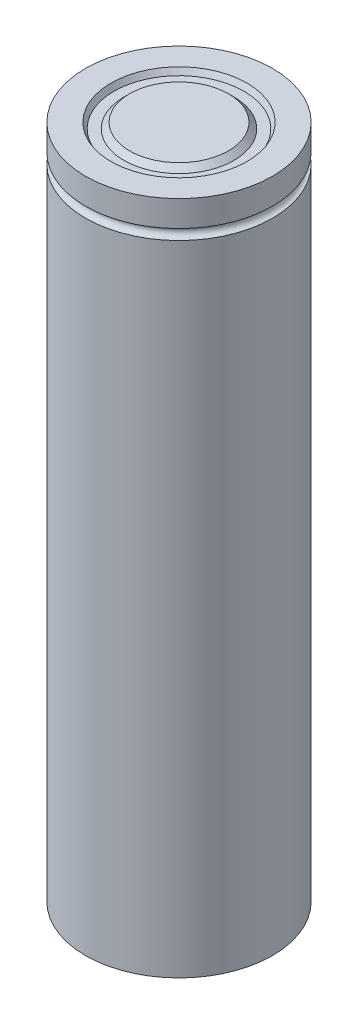
ISO-10303-21;
HEADER;
FILE_DESCRIPTION(('STEP AP214'),'2;1');
FILE_NAME('part.step','',(''),(''),'','','');
FILE_SCHEMA(('AUTOMOTIVE_DESIGN { 1 0 10303 214 1 1 1 1 }'));
ENDSEC;
DATA;
#1=APPLICATION_CONTEXT('core data for automotive mechanical design processes');
#2=APPLICATION_PROTOCOL_DEFINITION('international standard','automotive_design',2000,#1);
#3=PRODUCT_CONTEXT('',#1,'mechanical');
#4=PRODUCT('Part','Part','',(#3));
#5=PRODUCT_RELATED_PRODUCT_CATEGORY('part','',(#4));
#6=PRODUCT_DEFINITION_FORMATION('','',#4);
#7=PRODUCT_DEFINITION_CONTEXT('part definition',#1,'design');
#8=PRODUCT_DEFINITION('design','',#6,#7);
#9=PRODUCT_DEFINITION_SHAPE('','',#8);
#10=(LENGTH_UNIT() NAMED_UNIT(*) SI_UNIT(.MILLI.,.METRE.));
#11=(NAMED_UNIT(*) PLANE_ANGLE_UNIT() SI_UNIT($,.RADIAN.));
#12=(NAMED_UNIT(*) SI_UNIT($,.STERADIAN.) SOLID_ANGLE_UNIT());
#13=UNCERTAINTY_MEASURE_WITH_UNIT(LENGTH_MEASURE(1.E-05),#10,'distance_accuracy_value','');
#14=(GEOMETRIC_REPRESENTATION_CONTEXT(3) GLOBAL_UNCERTAINTY_ASSIGNED_CONTEXT((#13)) GLOBAL_UNIT_ASSIGNED_CONTEXT((#10,
#11,#12)) REPRESENTATION_CONTEXT('',''));
#15=CARTESIAN_POINT('',(0.,0.,0.));
#16=DIRECTION('',(0.,0.,1.));
#17=DIRECTION('',(1.,0.,0.));
#18=AXIS2_PLACEMENT_3D('',#15,#16,#17);
#19=CARTESIAN_POINT('',(0.,65.,0.));
#20=DIRECTION('',(0.,-1.,0.));
#21=DIRECTION('',(0.,0.,-1.));
#22=AXIS2_PLACEMENT_3D('',#19,#20,#21);
#23=CYLINDRICAL_SURFACE('',#22,9.);
#24=CARTESIAN_POINT('',(0.,61.5,0.));
#25=DIRECTION('',(0.,1.,0.));
#26=DIRECTION('',(0.,0.,1.));
#27=AXIS2_PLACEMENT_3D('',#24,#25,#26);
#28=CIRCLE('',#27,9.);
#29=CARTESIAN_POINT('',(0.,61.5,9.));
#30=VERTEX_POINT('',#29);
#31=EDGE_CURVE('E35',#30,#30,#28,.F.);
#32=ORIENTED_EDGE('',*,*,#31,.T.);
#33=EDGE_LOOP('',(#32));
#34=FACE_BOUND('',#33,.T.);
#35=CARTESIAN_POINT('',(0.,0.,0.));
#36=DIRECTION('',(0.,1.,0.));
#37=DIRECTION('',(0.,0.,1.));
#38=AXIS2_PLACEMENT_3D('',#35,#36,#37);
#39=CIRCLE('',#38,9.);
#40=CARTESIAN_POINT('',(0.,0.,9.));
#41=VERTEX_POINT('',#40);
#42=EDGE_CURVE('E39',#41,#41,#39,.T.);
#43=ORIENTED_EDGE('',*,*,#42,.T.);
#44=EDGE_LOOP('',(#43));
#45=FACE_BOUND('',#44,.T.);
#46=ADVANCED_FACE('F31',(#34,#45),#23,.T.);
#47=CARTESIAN_POINT('',(0.,0.,0.));
#48=DIRECTION('',(0.,1.,0.));
#49=DIRECTION('',(0.,0.,1.));
#50=AXIS2_PLACEMENT_3D('',#47,#48,#49);
#51=PLANE('',#50);
#52=ORIENTED_EDGE('',*,*,#42,.F.);
#53=EDGE_LOOP('',(#52));
#54=FACE_BOUND('',#53,.T.);
#55=ADVANCED_FACE('F84',(#54),#51,.F.);
#56=CARTESIAN_POINT('',(0.,62.,0.));
#57=DIRECTION('',(0.,-1.,0.));
#58=DIRECTION('',(0.,0.,-1.));
#59=AXIS2_PLACEMENT_3D('',#56,#57,#58);
#60=TOROIDAL_SURFACE('',#59,9.,0.500000000000001);
#61=CARTESIAN_POINT('',(0.,62.5,0.));
#62=DIRECTION('',(0.,-1.,0.));
#63=DIRECTION('',(0.,0.,-1.));
#64=AXIS2_PLACEMENT_3D('',#61,#62,#63);
#65=CIRCLE('',#64,9.);
#66=CARTESIAN_POINT('',(0.,62.5,-9.));
#67=VERTEX_POINT('',#66);
#68=EDGE_CURVE('E48',#67,#67,#65,.F.);
#69=ORIENTED_EDGE('',*,*,#68,.F.);
#70=EDGE_LOOP('',(#69));
#71=FACE_BOUND('',#70,.T.);
#72=ORIENTED_EDGE('',*,*,#31,.F.);
#73=EDGE_LOOP('',(#72));
#74=FACE_BOUND('',#73,.T.);
#75=ADVANCED_FACE('F82',(#71,#74),#60,.F.);
#76=CARTESIAN_POINT('',(0.,65.,0.));
#77=DIRECTION('',(0.,1.,0.));
#78=DIRECTION('',(0.,0.,1.));
#79=AXIS2_PLACEMENT_3D('',#76,#77,#78);
#80=PLANE('',#79);
#81=CARTESIAN_POINT('',(0.,65.,0.));
#82=DIRECTION('',(0.,1.,0.));
#83=DIRECTION('',(0.,0.,1.));
#84=AXIS2_PLACEMENT_3D('',#81,#82,#83);
#85=CIRCLE('',#84,9.);
#86=CARTESIAN_POINT('',(0.,65.,9.));
#87=VERTEX_POINT('',#86);
#88=EDGE_CURVE('E10',#87,#87,#85,.T.);
#89=ORIENTED_EDGE('',*,*,#88,.T.);
#90=EDGE_LOOP('',(#89));
#91=FACE_BOUND('',#90,.T.);
#92=CARTESIAN_POINT('',(0.,65.,0.));
#93=DIRECTION('',(0.,-1.,0.));
#94=DIRECTION('',(0.,0.,-1.));
#95=AXIS2_PLACEMENT_3D('',#92,#93,#94);
#96=CIRCLE('',#95,6.5487464687143);
#97=CARTESIAN_POINT('',(0.,65.,-6.5487464687143));
#98=VERTEX_POINT('',#97);
#99=EDGE_CURVE('E46',#98,#98,#96,.T.);
#100=ORIENTED_EDGE('',*,*,#99,.T.);
#101=EDGE_LOOP('',(#100));
#102=FACE_BOUND('',#101,.T.);
#103=ADVANCED_FACE('F73',(#91,#102),#80,.T.);
#104=ORIENTED_EDGE('',*,*,#68,.T.);
#105=EDGE_LOOP('',(#104));
#106=FACE_BOUND('',#105,.T.);
#107=ORIENTED_EDGE('',*,*,#88,.F.);
#108=EDGE_LOOP('',(#107));
#109=FACE_BOUND('',#108,.T.);
#110=ADVANCED_FACE('F33',(#106,#109),#23,.T.);
#111=CARTESIAN_POINT('',(0.,64.4667631395083,0.));
#112=DIRECTION('',(0.,1.,0.));
#113=DIRECTION('',(0.,0.,1.));
#114=AXIS2_PLACEMENT_3D('',#111,#112,#113);
#115=CONICAL_SURFACE('',#114,6.25589462541494,0.502226148274236);
#116=ORIENTED_EDGE('',*,*,#99,.F.);
#117=EDGE_LOOP('',(#116));
#118=FACE_BOUND('',#117,.T.);
#119=CARTESIAN_POINT('',(0.,64.4667631395083,0.));
#120=DIRECTION('',(0.,-1.,0.));
#121=DIRECTION('',(0.,0.,-1.));
#122=AXIS2_PLACEMENT_3D('',#119,#120,#121);
#123=CIRCLE('',#122,6.25589462541494);
#124=CARTESIAN_POINT('',(0.,64.4667631395083,-6.25589462541494));
#125=VERTEX_POINT('',#124);
#126=EDGE_CURVE('E54',#125,#125,#123,.T.);
#127=ORIENTED_EDGE('',*,*,#126,.T.);
#128=EDGE_LOOP('',(#127));
#129=FACE_BOUND('',#128,.T.);
#130=ADVANCED_FACE('F92',(#118,#129),#115,.F.);
#131=CARTESIAN_POINT('',(0.,64.4667631395083,-6.25589462541494));
#132=DIRECTION('',(0.,-1.,0.));
#133=DIRECTION('',(0.,0.,-1.));
#134=AXIS2_PLACEMENT_3D('',#131,#132,#133);
#135=PLANE('',#134);
#136=ORIENTED_EDGE('',*,*,#126,.F.);
#137=EDGE_LOOP('',(#136));
#138=FACE_BOUND('',#137,.T.);
#139=CARTESIAN_POINT('',(0.,64.4667631395083,0.));
#140=DIRECTION('',(0.,-1.,0.));
#141=DIRECTION('',(0.,0.,-1.));
#142=AXIS2_PLACEMENT_3D('',#139,#140,#141);
#143=CIRCLE('',#142,5.29747041098067);
#144=CARTESIAN_POINT('',(0.,64.4667631395083,-5.29747041098067));
#145=VERTEX_POINT('',#144);
#146=EDGE_CURVE('E58',#145,#145,#143,.T.);
#147=ORIENTED_EDGE('',*,*,#146,.T.);
#148=EDGE_LOOP('',(#147));
#149=FACE_BOUND('',#148,.T.);
#150=ADVANCED_FACE('F77',(#138,#149),#135,.F.);
#151=CARTESIAN_POINT('',(0.,65.,0.));
#152=DIRECTION('',(0.,-1.,0.));
#153=DIRECTION('',(0.,0.,-1.));
#154=AXIS2_PLACEMENT_3D('',#151,#152,#153);
#155=CONICAL_SURFACE('',#154,4.76423355048896,0.785398163397461);
#156=ORIENTED_EDGE('',*,*,#146,.F.);
#157=EDGE_LOOP('',(#156));
#158=FACE_BOUND('',#157,.T.);
#159=CARTESIAN_POINT('',(0.,65.,0.));
#160=DIRECTION('',(0.,-1.,0.));
#161=DIRECTION('',(0.,0.,-1.));
#162=AXIS2_PLACEMENT_3D('',#159,#160,#161);
#163=CIRCLE('',#162,4.76423355048896);
#164=CARTESIAN_POINT('',(0.,65.,-4.76423355048896));
#165=VERTEX_POINT('',#164);
#166=EDGE_CURVE('E62',#165,#165,#163,.T.);
#167=ORIENTED_EDGE('',*,*,#166,.T.);
#168=EDGE_LOOP('',(#167));
#169=FACE_BOUND('',#168,.T.);
#170=ADVANCED_FACE('F68',(#158,#169),#155,.T.);
#171=ORIENTED_EDGE('',*,*,#166,.F.);
#172=EDGE_LOOP('',(#171));
#173=FACE_BOUND('',#172,.T.);
#174=ADVANCED_FACE('F70',(#173),#80,.T.);
#175=CLOSED_SHELL('',(#46,#55,#75,#103,#110,#130,#150,#170,#174));
#176=MANIFOLD_SOLID_BREP('B2',#175);
#177=ADVANCED_BREP_SHAPE_REPRESENTATION('',(#18,#176),#14);
#178=SHAPE_DEFINITION_REPRESENTATION(#9,#177);
ENDSEC;
END-ISO-10303-21;
